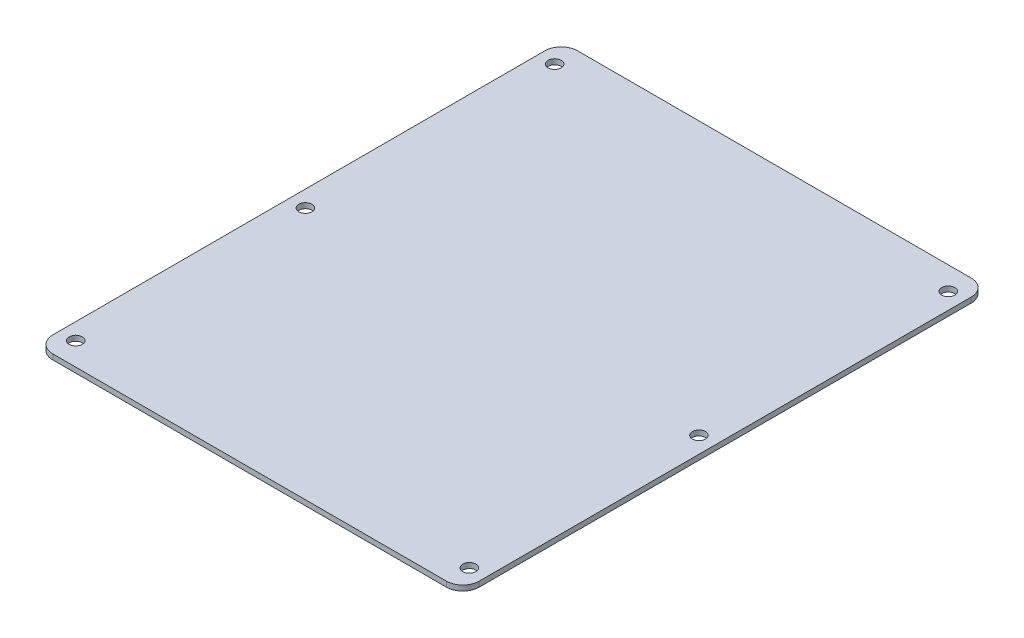
ISO-10303-21;
HEADER;
FILE_DESCRIPTION(('STEP AP214'),'2;1');
FILE_NAME('part.step','',(''),(''),'','','');
FILE_SCHEMA(('AUTOMOTIVE_DESIGN { 1 0 10303 214 1 1 1 1 }'));
ENDSEC;
DATA;
#1=APPLICATION_CONTEXT('core data for automotive mechanical design processes');
#2=APPLICATION_PROTOCOL_DEFINITION('international standard','automotive_design',2000,#1);
#3=PRODUCT_CONTEXT('',#1,'mechanical');
#4=PRODUCT('Part','Part','',(#3));
#5=PRODUCT_RELATED_PRODUCT_CATEGORY('part','',(#4));
#6=PRODUCT_DEFINITION_FORMATION('','',#4);
#7=PRODUCT_DEFINITION_CONTEXT('part definition',#1,'design');
#8=PRODUCT_DEFINITION('design','',#6,#7);
#9=PRODUCT_DEFINITION_SHAPE('','',#8);
#10=(LENGTH_UNIT() NAMED_UNIT(*) SI_UNIT(.MILLI.,.METRE.));
#11=(NAMED_UNIT(*) PLANE_ANGLE_UNIT() SI_UNIT($,.RADIAN.));
#12=(NAMED_UNIT(*) SI_UNIT($,.STERADIAN.) SOLID_ANGLE_UNIT());
#13=UNCERTAINTY_MEASURE_WITH_UNIT(LENGTH_MEASURE(1.E-05),#10,'distance_accuracy_value','');
#14=(GEOMETRIC_REPRESENTATION_CONTEXT(3) GLOBAL_UNCERTAINTY_ASSIGNED_CONTEXT((#13)) GLOBAL_UNIT_ASSIGNED_CONTEXT((#10,
#11,#12)) REPRESENTATION_CONTEXT('',''));
#15=CARTESIAN_POINT('',(0.,0.,0.));
#16=DIRECTION('',(0.,0.,1.));
#17=DIRECTION('',(1.,0.,0.));
#18=AXIS2_PLACEMENT_3D('',#15,#16,#17);
#19=CARTESIAN_POINT('',(65.,1.6,-80.));
#20=DIRECTION('',(-1.,0.,0.));
#21=DIRECTION('',(0.,0.,1.));
#22=AXIS2_PLACEMENT_3D('',#19,#20,#21);
#23=PLANE('',#22);
#24=DIRECTION('',(0.,0.,-1.));
#25=VECTOR('',#24,1.);
#26=CARTESIAN_POINT('',(65.,0.,-80.));
#27=LINE('',#26,#25);
#28=CARTESIAN_POINT('',(65.,0.,75.));
#29=VERTEX_POINT('',#28);
#30=CARTESIAN_POINT('',(65.,0.,-75.));
#31=VERTEX_POINT('',#30);
#32=EDGE_CURVE('E140',#29,#31,#27,.T.);
#33=ORIENTED_EDGE('',*,*,#32,.T.);
#34=DIRECTION('',(0.,-1.,0.));
#35=VECTOR('',#34,1.);
#36=CARTESIAN_POINT('',(65.,1.6,-75.));
#37=LINE('',#36,#35);
#38=CARTESIAN_POINT('',(65.,1.6,-75.));
#39=VERTEX_POINT('',#38);
#40=EDGE_CURVE('E115',#31,#39,#37,.F.);
#41=ORIENTED_EDGE('',*,*,#40,.T.);
#42=DIRECTION('',(0.,0.,-1.));
#43=VECTOR('',#42,1.);
#44=CARTESIAN_POINT('',(65.,1.6,-80.));
#45=LINE('',#44,#43);
#46=CARTESIAN_POINT('',(65.,1.6,75.));
#47=VERTEX_POINT('',#46);
#48=EDGE_CURVE('E153',#47,#39,#45,.T.);
#49=ORIENTED_EDGE('',*,*,#48,.F.);
#50=DIRECTION('',(0.,-1.,0.));
#51=VECTOR('',#50,1.);
#52=CARTESIAN_POINT('',(65.,1.6,75.));
#53=LINE('',#52,#51);
#54=EDGE_CURVE('E121',#47,#29,#53,.T.);
#55=ORIENTED_EDGE('',*,*,#54,.T.);
#56=EDGE_LOOP('',(#33,#41,#49,#55));
#57=FACE_BOUND('',#56,.T.);
#58=ADVANCED_FACE('F43',(#57),#23,.F.);
#59=CARTESIAN_POINT('',(-65.,1.6,-80.));
#60=DIRECTION('',(0.,0.,1.));
#61=DIRECTION('',(1.,0.,0.));
#62=AXIS2_PLACEMENT_3D('',#59,#60,#61);
#63=PLANE('',#62);
#64=DIRECTION('',(-1.,0.,0.));
#65=VECTOR('',#64,1.);
#66=CARTESIAN_POINT('',(-65.,1.6,-80.));
#67=LINE('',#66,#65);
#68=CARTESIAN_POINT('',(60.,1.6,-80.));
#69=VERTEX_POINT('',#68);
#70=CARTESIAN_POINT('',(-60.,1.6,-80.));
#71=VERTEX_POINT('',#70);
#72=EDGE_CURVE('E131',#69,#71,#67,.T.);
#73=ORIENTED_EDGE('',*,*,#72,.F.);
#74=DIRECTION('',(0.,-1.,0.));
#75=VECTOR('',#74,1.);
#76=CARTESIAN_POINT('',(60.,1.6,-80.));
#77=LINE('',#76,#75);
#78=CARTESIAN_POINT('',(60.,0.,-80.));
#79=VERTEX_POINT('',#78);
#80=EDGE_CURVE('E114',#69,#79,#77,.T.);
#81=ORIENTED_EDGE('',*,*,#80,.T.);
#82=DIRECTION('',(-1.,0.,0.));
#83=VECTOR('',#82,1.);
#84=CARTESIAN_POINT('',(-65.,0.,-80.));
#85=LINE('',#84,#83);
#86=CARTESIAN_POINT('',(-60.,0.,-80.));
#87=VERTEX_POINT('',#86);
#88=EDGE_CURVE('E128',#79,#87,#85,.T.);
#89=ORIENTED_EDGE('',*,*,#88,.T.);
#90=DIRECTION('',(0.,-1.,0.));
#91=VECTOR('',#90,1.);
#92=CARTESIAN_POINT('',(-60.,1.6,-80.));
#93=LINE('',#92,#91);
#94=EDGE_CURVE('E134',#87,#71,#93,.F.);
#95=ORIENTED_EDGE('',*,*,#94,.T.);
#96=EDGE_LOOP('',(#73,#81,#89,#95));
#97=FACE_BOUND('',#96,.T.);
#98=ADVANCED_FACE('F127',(#97),#63,.F.);
#99=CARTESIAN_POINT('',(-65.,1.6,-80.));
#100=DIRECTION('',(1.,0.,0.));
#101=DIRECTION('',(0.,0.,-1.));
#102=AXIS2_PLACEMENT_3D('',#99,#100,#101);
#103=PLANE('',#102);
#104=DIRECTION('',(0.,0.,1.));
#105=VECTOR('',#104,1.);
#106=CARTESIAN_POINT('',(-65.,1.6,-80.));
#107=LINE('',#106,#105);
#108=CARTESIAN_POINT('',(-65.,1.6,-75.));
#109=VERTEX_POINT('',#108);
#110=CARTESIAN_POINT('',(-65.,1.6,75.));
#111=VERTEX_POINT('',#110);
#112=EDGE_CURVE('E189',#109,#111,#107,.T.);
#113=ORIENTED_EDGE('',*,*,#112,.F.);
#114=DIRECTION('',(0.,-1.,0.));
#115=VECTOR('',#114,1.);
#116=CARTESIAN_POINT('',(-65.,1.6,-75.));
#117=LINE('',#116,#115);
#118=CARTESIAN_POINT('',(-65.,0.,-75.));
#119=VERTEX_POINT('',#118);
#120=EDGE_CURVE('E183',#109,#119,#117,.T.);
#121=ORIENTED_EDGE('',*,*,#120,.T.);
#122=DIRECTION('',(0.,0.,1.));
#123=VECTOR('',#122,1.);
#124=CARTESIAN_POINT('',(-65.,0.,-80.));
#125=LINE('',#124,#123);
#126=CARTESIAN_POINT('',(-65.,0.,75.));
#127=VERTEX_POINT('',#126);
#128=EDGE_CURVE('E139',#119,#127,#125,.T.);
#129=ORIENTED_EDGE('',*,*,#128,.T.);
#130=DIRECTION('',(0.,-1.,0.));
#131=VECTOR('',#130,1.);
#132=CARTESIAN_POINT('',(-65.,1.6,75.));
#133=LINE('',#132,#131);
#134=EDGE_CURVE('E180',#127,#111,#133,.F.);
#135=ORIENTED_EDGE('',*,*,#134,.T.);
#136=EDGE_LOOP('',(#113,#121,#129,#135));
#137=FACE_BOUND('',#136,.T.);
#138=ADVANCED_FACE('F277',(#137),#103,.F.);
#139=CARTESIAN_POINT('',(-65.,1.6,80.));
#140=DIRECTION('',(0.,0.,-1.));
#141=DIRECTION('',(-1.,0.,0.));
#142=AXIS2_PLACEMENT_3D('',#139,#140,#141);
#143=PLANE('',#142);
#144=DIRECTION('',(1.,0.,0.));
#145=VECTOR('',#144,1.);
#146=CARTESIAN_POINT('',(-65.,1.6,80.));
#147=LINE('',#146,#145);
#148=CARTESIAN_POINT('',(-60.,1.6,80.));
#149=VERTEX_POINT('',#148);
#150=CARTESIAN_POINT('',(60.,1.6,80.));
#151=VERTEX_POINT('',#150);
#152=EDGE_CURVE('E155',#149,#151,#147,.T.);
#153=ORIENTED_EDGE('',*,*,#152,.F.);
#154=DIRECTION('',(0.,-1.,0.));
#155=VECTOR('',#154,1.);
#156=CARTESIAN_POINT('',(-60.,1.6,80.));
#157=LINE('',#156,#155);
#158=CARTESIAN_POINT('',(-60.,0.,80.));
#159=VERTEX_POINT('',#158);
#160=EDGE_CURVE('E11',#149,#159,#157,.T.);
#161=ORIENTED_EDGE('',*,*,#160,.T.);
#162=DIRECTION('',(1.,0.,0.));
#163=VECTOR('',#162,1.);
#164=CARTESIAN_POINT('',(-65.,0.,80.));
#165=LINE('',#164,#163);
#166=CARTESIAN_POINT('',(60.,0.,80.));
#167=VERTEX_POINT('',#166);
#168=EDGE_CURVE('E145',#159,#167,#165,.T.);
#169=ORIENTED_EDGE('',*,*,#168,.T.);
#170=DIRECTION('',(0.,-1.,0.));
#171=VECTOR('',#170,1.);
#172=CARTESIAN_POINT('',(60.,1.6,80.));
#173=LINE('',#172,#171);
#174=EDGE_CURVE('E52',#167,#151,#173,.F.);
#175=ORIENTED_EDGE('',*,*,#174,.T.);
#176=EDGE_LOOP('',(#153,#161,#169,#175));
#177=FACE_BOUND('',#176,.T.);
#178=ADVANCED_FACE('F251',(#177),#143,.F.);
#179=CARTESIAN_POINT('',(0.,1.6,0.));
#180=DIRECTION('',(0.,1.,0.));
#181=DIRECTION('',(0.,0.,1.));
#182=AXIS2_PLACEMENT_3D('',#179,#180,#181);
#183=PLANE('',#182);
#184=CARTESIAN_POINT('',(60.,1.6,-73.));
#185=DIRECTION('',(0.,1.,0.));
#186=DIRECTION('',(0.,0.,-1.));
#187=AXIS2_PLACEMENT_3D('',#184,#185,#186);
#188=CIRCLE('',#187,2.);
#189=CARTESIAN_POINT('',(60.,1.6,-75.));
#190=VERTEX_POINT('',#189);
#191=EDGE_CURVE('E210',#190,#190,#188,.T.);
#192=ORIENTED_EDGE('',*,*,#191,.F.);
#193=EDGE_LOOP('',(#192));
#194=FACE_BOUND('',#193,.T.);
#195=CARTESIAN_POINT('',(60.,1.6,2.99999999999999));
#196=DIRECTION('',(0.,1.,0.));
#197=DIRECTION('',(0.,0.,-1.));
#198=AXIS2_PLACEMENT_3D('',#195,#196,#197);
#199=CIRCLE('',#198,2.);
#200=CARTESIAN_POINT('',(60.,1.6,0.999999999999986));
#201=VERTEX_POINT('',#200);
#202=EDGE_CURVE('E218',#201,#201,#199,.T.);
#203=ORIENTED_EDGE('',*,*,#202,.F.);
#204=EDGE_LOOP('',(#203));
#205=FACE_BOUND('',#204,.T.);
#206=CARTESIAN_POINT('',(60.,1.6,73.));
#207=DIRECTION('',(0.,1.,0.));
#208=DIRECTION('',(0.,0.,-1.));
#209=AXIS2_PLACEMENT_3D('',#206,#207,#208);
#210=CIRCLE('',#209,2.);
#211=CARTESIAN_POINT('',(60.,1.6,71.));
#212=VERTEX_POINT('',#211);
#213=EDGE_CURVE('E226',#212,#212,#210,.T.);
#214=ORIENTED_EDGE('',*,*,#213,.F.);
#215=EDGE_LOOP('',(#214));
#216=FACE_BOUND('',#215,.T.);
#217=CARTESIAN_POINT('',(-60.,1.6,73.));
#218=DIRECTION('',(0.,1.,0.));
#219=DIRECTION('',(0.,0.,1.));
#220=AXIS2_PLACEMENT_3D('',#217,#218,#219);
#221=CIRCLE('',#220,2.);
#222=CARTESIAN_POINT('',(-60.,1.6,75.));
#223=VERTEX_POINT('',#222);
#224=EDGE_CURVE('E234',#223,#223,#221,.T.);
#225=ORIENTED_EDGE('',*,*,#224,.F.);
#226=EDGE_LOOP('',(#225));
#227=FACE_BOUND('',#226,.T.);
#228=CARTESIAN_POINT('',(-60.,1.6,2.99999999999999));
#229=DIRECTION('',(0.,1.,0.));
#230=DIRECTION('',(0.,0.,1.));
#231=AXIS2_PLACEMENT_3D('',#228,#229,#230);
#232=CIRCLE('',#231,2.);
#233=CARTESIAN_POINT('',(-60.,1.6,4.99999999999999));
#234=VERTEX_POINT('',#233);
#235=EDGE_CURVE('E202',#234,#234,#232,.T.);
#236=ORIENTED_EDGE('',*,*,#235,.F.);
#237=EDGE_LOOP('',(#236));
#238=FACE_BOUND('',#237,.T.);
#239=CARTESIAN_POINT('',(-60.,1.6,-73.));
#240=DIRECTION('',(0.,1.,0.));
#241=DIRECTION('',(0.,0.,1.));
#242=AXIS2_PLACEMENT_3D('',#239,#240,#241);
#243=CIRCLE('',#242,2.);
#244=CARTESIAN_POINT('',(-60.,1.6,-71.));
#245=VERTEX_POINT('',#244);
#246=EDGE_CURVE('E198',#245,#245,#243,.T.);
#247=ORIENTED_EDGE('',*,*,#246,.F.);
#248=EDGE_LOOP('',(#247));
#249=FACE_BOUND('',#248,.T.);
#250=ORIENTED_EDGE('',*,*,#48,.T.);
#251=CARTESIAN_POINT('',(60.,1.6,-75.));
#252=DIRECTION('',(0.,1.,0.));
#253=DIRECTION('',(0.,0.,1.));
#254=AXIS2_PLACEMENT_3D('',#251,#252,#253);
#255=CIRCLE('',#254,5.);
#256=EDGE_CURVE('E177',#39,#69,#255,.T.);
#257=ORIENTED_EDGE('',*,*,#256,.T.);
#258=ORIENTED_EDGE('',*,*,#72,.T.);
#259=CARTESIAN_POINT('',(-60.,1.6,-75.));
#260=DIRECTION('',(0.,1.,0.));
#261=DIRECTION('',(0.,0.,1.));
#262=AXIS2_PLACEMENT_3D('',#259,#260,#261);
#263=CIRCLE('',#262,5.);
#264=EDGE_CURVE('E174',#71,#109,#263,.T.);
#265=ORIENTED_EDGE('',*,*,#264,.T.);
#266=ORIENTED_EDGE('',*,*,#112,.T.);
#267=CARTESIAN_POINT('',(-60.,1.6,75.));
#268=DIRECTION('',(0.,1.,0.));
#269=DIRECTION('',(0.,0.,1.));
#270=AXIS2_PLACEMENT_3D('',#267,#268,#269);
#271=CIRCLE('',#270,5.);
#272=EDGE_CURVE('E65',#111,#149,#271,.T.);
#273=ORIENTED_EDGE('',*,*,#272,.T.);
#274=ORIENTED_EDGE('',*,*,#152,.T.);
#275=CARTESIAN_POINT('',(60.,1.6,75.));
#276=DIRECTION('',(0.,1.,0.));
#277=DIRECTION('',(0.,0.,1.));
#278=AXIS2_PLACEMENT_3D('',#275,#276,#277);
#279=CIRCLE('',#278,5.);
#280=EDGE_CURVE('E169',#151,#47,#279,.T.);
#281=ORIENTED_EDGE('',*,*,#280,.T.);
#282=EDGE_LOOP('',(#250,#257,#258,#265,#266,#273,#274,#281));
#283=FACE_BOUND('',#282,.T.);
#284=ADVANCED_FACE('F248',(#194,#205,#216,#227,#238,#249,#283),#183,.T.);
#285=CARTESIAN_POINT('',(0.,0.,0.));
#286=DIRECTION('',(0.,1.,0.));
#287=DIRECTION('',(0.,0.,1.));
#288=AXIS2_PLACEMENT_3D('',#285,#286,#287);
#289=PLANE('',#288);
#290=CARTESIAN_POINT('',(60.,0.,-73.));
#291=DIRECTION('',(0.,1.,0.));
#292=DIRECTION('',(0.,0.,-1.));
#293=AXIS2_PLACEMENT_3D('',#290,#291,#292);
#294=CIRCLE('',#293,2.);
#295=CARTESIAN_POINT('',(60.,0.,-75.));
#296=VERTEX_POINT('',#295);
#297=EDGE_CURVE('E206',#296,#296,#294,.T.);
#298=ORIENTED_EDGE('',*,*,#297,.T.);
#299=EDGE_LOOP('',(#298));
#300=FACE_BOUND('',#299,.T.);
#301=CARTESIAN_POINT('',(60.,0.,2.99999999999999));
#302=DIRECTION('',(0.,1.,0.));
#303=DIRECTION('',(0.,0.,-1.));
#304=AXIS2_PLACEMENT_3D('',#301,#302,#303);
#305=CIRCLE('',#304,2.);
#306=CARTESIAN_POINT('',(60.,0.,0.999999999999986));
#307=VERTEX_POINT('',#306);
#308=EDGE_CURVE('E214',#307,#307,#305,.T.);
#309=ORIENTED_EDGE('',*,*,#308,.T.);
#310=EDGE_LOOP('',(#309));
#311=FACE_BOUND('',#310,.T.);
#312=CARTESIAN_POINT('',(60.,0.,73.));
#313=DIRECTION('',(0.,1.,0.));
#314=DIRECTION('',(0.,0.,-1.));
#315=AXIS2_PLACEMENT_3D('',#312,#313,#314);
#316=CIRCLE('',#315,2.);
#317=CARTESIAN_POINT('',(60.,0.,71.));
#318=VERTEX_POINT('',#317);
#319=EDGE_CURVE('E222',#318,#318,#316,.T.);
#320=ORIENTED_EDGE('',*,*,#319,.T.);
#321=EDGE_LOOP('',(#320));
#322=FACE_BOUND('',#321,.T.);
#323=CARTESIAN_POINT('',(-60.,0.,73.));
#324=DIRECTION('',(0.,1.,0.));
#325=DIRECTION('',(0.,0.,1.));
#326=AXIS2_PLACEMENT_3D('',#323,#324,#325);
#327=CIRCLE('',#326,2.);
#328=CARTESIAN_POINT('',(-60.,0.,75.));
#329=VERTEX_POINT('',#328);
#330=EDGE_CURVE('E230',#329,#329,#327,.T.);
#331=ORIENTED_EDGE('',*,*,#330,.T.);
#332=EDGE_LOOP('',(#331));
#333=FACE_BOUND('',#332,.T.);
#334=CARTESIAN_POINT('',(-60.,0.,2.99999999999999));
#335=DIRECTION('',(0.,1.,0.));
#336=DIRECTION('',(0.,0.,1.));
#337=AXIS2_PLACEMENT_3D('',#334,#335,#336);
#338=CIRCLE('',#337,2.);
#339=CARTESIAN_POINT('',(-60.,0.,4.99999999999999));
#340=VERTEX_POINT('',#339);
#341=EDGE_CURVE('E238',#340,#340,#338,.T.);
#342=ORIENTED_EDGE('',*,*,#341,.T.);
#343=EDGE_LOOP('',(#342));
#344=FACE_BOUND('',#343,.T.);
#345=CARTESIAN_POINT('',(-60.,0.,-73.));
#346=DIRECTION('',(0.,1.,0.));
#347=DIRECTION('',(0.,0.,1.));
#348=AXIS2_PLACEMENT_3D('',#345,#346,#347);
#349=CIRCLE('',#348,2.);
#350=CARTESIAN_POINT('',(-60.,0.,-71.));
#351=VERTEX_POINT('',#350);
#352=EDGE_CURVE('E147',#351,#351,#349,.T.);
#353=ORIENTED_EDGE('',*,*,#352,.T.);
#354=EDGE_LOOP('',(#353));
#355=FACE_BOUND('',#354,.T.);
#356=ORIENTED_EDGE('',*,*,#88,.F.);
#357=CARTESIAN_POINT('',(60.,0.,-75.));
#358=DIRECTION('',(0.,1.,0.));
#359=DIRECTION('',(0.,0.,1.));
#360=AXIS2_PLACEMENT_3D('',#357,#358,#359);
#361=CIRCLE('',#360,5.);
#362=EDGE_CURVE('E110',#79,#31,#361,.F.);
#363=ORIENTED_EDGE('',*,*,#362,.T.);
#364=ORIENTED_EDGE('',*,*,#32,.F.);
#365=CARTESIAN_POINT('',(60.,0.,75.));
#366=DIRECTION('',(0.,1.,0.));
#367=DIRECTION('',(0.,0.,1.));
#368=AXIS2_PLACEMENT_3D('',#365,#366,#367);
#369=CIRCLE('',#368,5.);
#370=EDGE_CURVE('E133',#29,#167,#369,.F.);
#371=ORIENTED_EDGE('',*,*,#370,.T.);
#372=ORIENTED_EDGE('',*,*,#168,.F.);
#373=CARTESIAN_POINT('',(-60.,0.,75.));
#374=DIRECTION('',(0.,1.,0.));
#375=DIRECTION('',(0.,0.,1.));
#376=AXIS2_PLACEMENT_3D('',#373,#374,#375);
#377=CIRCLE('',#376,5.);
#378=EDGE_CURVE('E159',#159,#127,#377,.F.);
#379=ORIENTED_EDGE('',*,*,#378,.T.);
#380=ORIENTED_EDGE('',*,*,#128,.F.);
#381=CARTESIAN_POINT('',(-60.,0.,-75.));
#382=DIRECTION('',(0.,1.,0.));
#383=DIRECTION('',(0.,0.,1.));
#384=AXIS2_PLACEMENT_3D('',#381,#382,#383);
#385=CIRCLE('',#384,5.);
#386=EDGE_CURVE('E122',#119,#87,#385,.F.);
#387=ORIENTED_EDGE('',*,*,#386,.T.);
#388=EDGE_LOOP('',(#356,#363,#364,#371,#372,#379,#380,#387));
#389=FACE_BOUND('',#388,.T.);
#390=ADVANCED_FACE('F136',(#300,#311,#322,#333,#344,#355,#389),#289,.F.);
#391=CARTESIAN_POINT('',(-60.,0.,-73.));
#392=DIRECTION('',(0.,1.,0.));
#393=DIRECTION('',(0.,0.,1.));
#394=AXIS2_PLACEMENT_3D('',#391,#392,#393);
#395=CYLINDRICAL_SURFACE('',#394,2.);
#396=ORIENTED_EDGE('',*,*,#352,.F.);
#397=EDGE_LOOP('',(#396));
#398=FACE_BOUND('',#397,.T.);
#399=ORIENTED_EDGE('',*,*,#246,.T.);
#400=EDGE_LOOP('',(#399));
#401=FACE_BOUND('',#400,.T.);
#402=ADVANCED_FACE('F256',(#398,#401),#395,.F.);
#403=CARTESIAN_POINT('',(-60.,0.,2.99999999999999));
#404=DIRECTION('',(0.,1.,0.));
#405=DIRECTION('',(0.,0.,1.));
#406=AXIS2_PLACEMENT_3D('',#403,#404,#405);
#407=CYLINDRICAL_SURFACE('',#406,2.);
#408=ORIENTED_EDGE('',*,*,#341,.F.);
#409=EDGE_LOOP('',(#408));
#410=FACE_BOUND('',#409,.T.);
#411=ORIENTED_EDGE('',*,*,#235,.T.);
#412=EDGE_LOOP('',(#411));
#413=FACE_BOUND('',#412,.T.);
#414=ADVANCED_FACE('F246',(#410,#413),#407,.F.);
#415=CARTESIAN_POINT('',(-60.,0.,73.));
#416=DIRECTION('',(0.,1.,0.));
#417=DIRECTION('',(0.,0.,1.));
#418=AXIS2_PLACEMENT_3D('',#415,#416,#417);
#419=CYLINDRICAL_SURFACE('',#418,2.);
#420=ORIENTED_EDGE('',*,*,#330,.F.);
#421=EDGE_LOOP('',(#420));
#422=FACE_BOUND('',#421,.T.);
#423=ORIENTED_EDGE('',*,*,#224,.T.);
#424=EDGE_LOOP('',(#423));
#425=FACE_BOUND('',#424,.T.);
#426=ADVANCED_FACE('F264',(#422,#425),#419,.F.);
#427=CARTESIAN_POINT('',(60.,0.,73.));
#428=DIRECTION('',(0.,1.,0.));
#429=DIRECTION('',(0.,0.,1.));
#430=AXIS2_PLACEMENT_3D('',#427,#428,#429);
#431=CYLINDRICAL_SURFACE('',#430,2.);
#432=ORIENTED_EDGE('',*,*,#319,.F.);
#433=EDGE_LOOP('',(#432));
#434=FACE_BOUND('',#433,.T.);
#435=ORIENTED_EDGE('',*,*,#213,.T.);
#436=EDGE_LOOP('',(#435));
#437=FACE_BOUND('',#436,.T.);
#438=ADVANCED_FACE('F368',(#434,#437),#431,.F.);
#439=CARTESIAN_POINT('',(60.,0.,2.99999999999999));
#440=DIRECTION('',(0.,1.,0.));
#441=DIRECTION('',(0.,0.,1.));
#442=AXIS2_PLACEMENT_3D('',#439,#440,#441);
#443=CYLINDRICAL_SURFACE('',#442,2.);
#444=ORIENTED_EDGE('',*,*,#308,.F.);
#445=EDGE_LOOP('',(#444));
#446=FACE_BOUND('',#445,.T.);
#447=ORIENTED_EDGE('',*,*,#202,.T.);
#448=EDGE_LOOP('',(#447));
#449=FACE_BOUND('',#448,.T.);
#450=ADVANCED_FACE('F359',(#446,#449),#443,.F.);
#451=CARTESIAN_POINT('',(60.,0.,-73.));
#452=DIRECTION('',(0.,1.,0.));
#453=DIRECTION('',(0.,0.,1.));
#454=AXIS2_PLACEMENT_3D('',#451,#452,#453);
#455=CYLINDRICAL_SURFACE('',#454,2.);
#456=ORIENTED_EDGE('',*,*,#297,.F.);
#457=EDGE_LOOP('',(#456));
#458=FACE_BOUND('',#457,.T.);
#459=ORIENTED_EDGE('',*,*,#191,.T.);
#460=EDGE_LOOP('',(#459));
#461=FACE_BOUND('',#460,.T.);
#462=ADVANCED_FACE('F284',(#458,#461),#455,.F.);
#463=CARTESIAN_POINT('',(60.,1.6,-75.));
#464=DIRECTION('',(0.,-1.,0.));
#465=DIRECTION('',(0.,0.,-1.));
#466=AXIS2_PLACEMENT_3D('',#463,#464,#465);
#467=CYLINDRICAL_SURFACE('',#466,5.);
#468=ORIENTED_EDGE('',*,*,#256,.F.);
#469=ORIENTED_EDGE('',*,*,#40,.F.);
#470=ORIENTED_EDGE('',*,*,#362,.F.);
#471=ORIENTED_EDGE('',*,*,#80,.F.);
#472=EDGE_LOOP('',(#468,#469,#470,#471));
#473=FACE_BOUND('',#472,.T.);
#474=ADVANCED_FACE('F113',(#473),#467,.T.);
#475=CARTESIAN_POINT('',(-60.,1.6,-75.));
#476=DIRECTION('',(0.,-1.,0.));
#477=DIRECTION('',(0.,0.,-1.));
#478=AXIS2_PLACEMENT_3D('',#475,#476,#477);
#479=CYLINDRICAL_SURFACE('',#478,5.);
#480=ORIENTED_EDGE('',*,*,#264,.F.);
#481=ORIENTED_EDGE('',*,*,#94,.F.);
#482=ORIENTED_EDGE('',*,*,#386,.F.);
#483=ORIENTED_EDGE('',*,*,#120,.F.);
#484=EDGE_LOOP('',(#480,#481,#482,#483));
#485=FACE_BOUND('',#484,.T.);
#486=ADVANCED_FACE('F283',(#485),#479,.T.);
#487=CARTESIAN_POINT('',(-60.,1.6,75.));
#488=DIRECTION('',(0.,-1.,0.));
#489=DIRECTION('',(0.,0.,-1.));
#490=AXIS2_PLACEMENT_3D('',#487,#488,#489);
#491=CYLINDRICAL_SURFACE('',#490,5.);
#492=ORIENTED_EDGE('',*,*,#272,.F.);
#493=ORIENTED_EDGE('',*,*,#134,.F.);
#494=ORIENTED_EDGE('',*,*,#378,.F.);
#495=ORIENTED_EDGE('',*,*,#160,.F.);
#496=EDGE_LOOP('',(#492,#493,#494,#495));
#497=FACE_BOUND('',#496,.T.);
#498=ADVANCED_FACE('F286',(#497),#491,.T.);
#499=CARTESIAN_POINT('',(60.,1.6,75.));
#500=DIRECTION('',(0.,-1.,0.));
#501=DIRECTION('',(0.,0.,-1.));
#502=AXIS2_PLACEMENT_3D('',#499,#500,#501);
#503=CYLINDRICAL_SURFACE('',#502,5.);
#504=ORIENTED_EDGE('',*,*,#280,.F.);
#505=ORIENTED_EDGE('',*,*,#174,.F.);
#506=ORIENTED_EDGE('',*,*,#370,.F.);
#507=ORIENTED_EDGE('',*,*,#54,.F.);
#508=EDGE_LOOP('',(#504,#505,#506,#507));
#509=FACE_BOUND('',#508,.T.);
#510=ADVANCED_FACE('F45',(#509),#503,.T.);
#511=CLOSED_SHELL('',(#58,#98,#138,#178,#284,#390,#402,#414,#426,#438,#450,#462,#474,#486,#498,#510));
#512=MANIFOLD_SOLID_BREP('B2',#511);
#513=ADVANCED_BREP_SHAPE_REPRESENTATION('',(#18,#512),#14);
#514=SHAPE_DEFINITION_REPRESENTATION(#9,#513);
ENDSEC;
END-ISO-10303-21;
